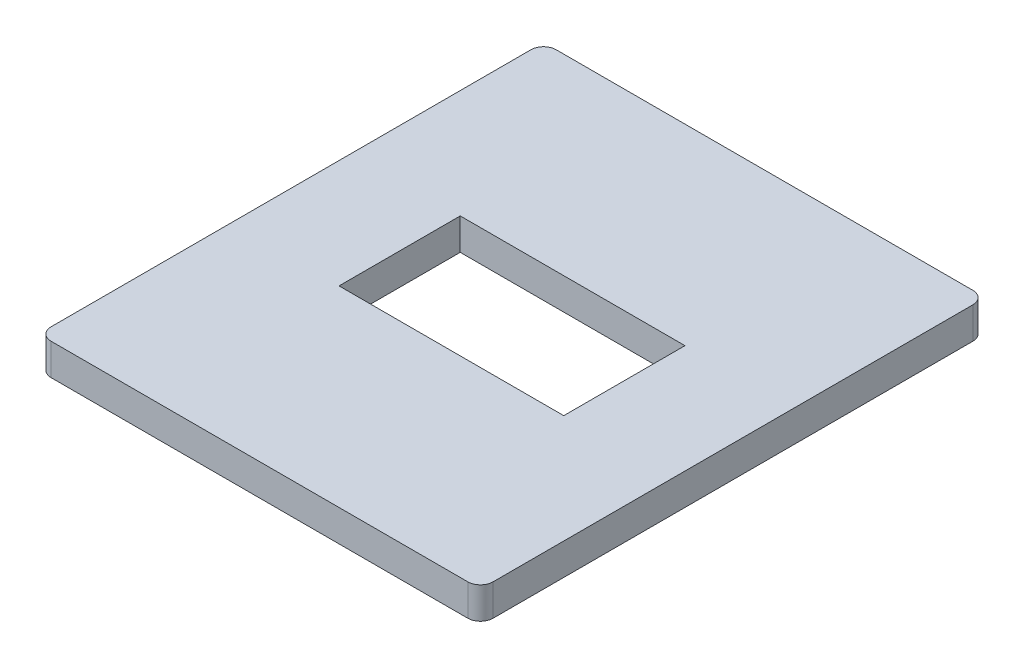
ISO-10303-21;
HEADER;
FILE_DESCRIPTION(('STEP AP214'),'2;1');
FILE_NAME('part.step','',(''),(''),'','','');
FILE_SCHEMA(('AUTOMOTIVE_DESIGN { 1 0 10303 214 1 1 1 1 }'));
ENDSEC;
DATA;
#1=APPLICATION_CONTEXT('core data for automotive mechanical design processes');
#2=APPLICATION_PROTOCOL_DEFINITION('international standard','automotive_design',2000,#1);
#3=PRODUCT_CONTEXT('',#1,'mechanical');
#4=PRODUCT('Part','Part','',(#3));
#5=PRODUCT_RELATED_PRODUCT_CATEGORY('part','',(#4));
#6=PRODUCT_DEFINITION_FORMATION('','',#4);
#7=PRODUCT_DEFINITION_CONTEXT('part definition',#1,'design');
#8=PRODUCT_DEFINITION('design','',#6,#7);
#9=PRODUCT_DEFINITION_SHAPE('','',#8);
#10=(LENGTH_UNIT() NAMED_UNIT(*) SI_UNIT(.MILLI.,.METRE.));
#11=(NAMED_UNIT(*) PLANE_ANGLE_UNIT() SI_UNIT($,.RADIAN.));
#12=(NAMED_UNIT(*) SI_UNIT($,.STERADIAN.) SOLID_ANGLE_UNIT());
#13=UNCERTAINTY_MEASURE_WITH_UNIT(LENGTH_MEASURE(1.E-05),#10,'distance_accuracy_value','');
#14=(GEOMETRIC_REPRESENTATION_CONTEXT(3) GLOBAL_UNCERTAINTY_ASSIGNED_CONTEXT((#13)) GLOBAL_UNIT_ASSIGNED_CONTEXT((#10,
#11,#12)) REPRESENTATION_CONTEXT('',''));
#15=CARTESIAN_POINT('',(0.,0.,0.));
#16=DIRECTION('',(0.,0.,1.));
#17=DIRECTION('',(1.,0.,0.));
#18=AXIS2_PLACEMENT_3D('',#15,#16,#17);
#19=CARTESIAN_POINT('',(0.,3.175,0.));
#20=DIRECTION('',(0.,1.,0.));
#21=DIRECTION('',(0.,0.,1.));
#22=AXIS2_PLACEMENT_3D('',#19,#20,#21);
#23=PLANE('',#22);
#24=DIRECTION('',(1.,0.,0.));
#25=VECTOR('',#24,1.);
#26=CARTESIAN_POINT('',(-22.554912538406,3.175,23.8437569767423));
#27=LINE('',#26,#25);
#28=CARTESIAN_POINT('',(-21.284912538406,3.175,23.8437569767423));
#29=VERTEX_POINT('',#28);
#30=CARTESIAN_POINT('',(20.625087461594,3.175,23.8437569767423));
#31=VERTEX_POINT('',#30);
#32=EDGE_CURVE('E163',#29,#31,#27,.T.);
#33=ORIENTED_EDGE('',*,*,#32,.T.);
#34=CARTESIAN_POINT('',(20.625087461594,3.175,22.5737569767423));
#35=DIRECTION('',(0.,1.,0.));
#36=DIRECTION('',(0.,0.,1.));
#37=AXIS2_PLACEMENT_3D('',#34,#35,#36);
#38=CIRCLE('',#37,1.27);
#39=CARTESIAN_POINT('',(21.895087461594,3.175,22.5737569767423));
#40=VERTEX_POINT('',#39);
#41=EDGE_CURVE('E206',#31,#40,#38,.T.);
#42=ORIENTED_EDGE('',*,*,#41,.T.);
#43=DIRECTION('',(0.,0.,-1.));
#44=VECTOR('',#43,1.);
#45=CARTESIAN_POINT('',(21.895087461594,3.175,23.8437569767423));
#46=LINE('',#45,#44);
#47=CARTESIAN_POINT('',(21.895087461594,3.175,-25.6862430232577));
#48=VERTEX_POINT('',#47);
#49=EDGE_CURVE('E166',#40,#48,#46,.T.);
#50=ORIENTED_EDGE('',*,*,#49,.T.);
#51=CARTESIAN_POINT('',(20.625087461594,3.175,-25.6862430232577));
#52=DIRECTION('',(0.,1.,0.));
#53=DIRECTION('',(0.,0.,1.));
#54=AXIS2_PLACEMENT_3D('',#51,#52,#53);
#55=CIRCLE('',#54,1.27);
#56=CARTESIAN_POINT('',(20.625087461594,3.175,-26.9562430232577));
#57=VERTEX_POINT('',#56);
#58=EDGE_CURVE('E204',#48,#57,#55,.T.);
#59=ORIENTED_EDGE('',*,*,#58,.T.);
#60=DIRECTION('',(-1.,0.,0.));
#61=VECTOR('',#60,1.);
#62=CARTESIAN_POINT('',(21.895087461594,3.175,-26.9562430232577));
#63=LINE('',#62,#61);
#64=CARTESIAN_POINT('',(-21.284912538406,3.175,-26.9562430232577));
#65=VERTEX_POINT('',#64);
#66=EDGE_CURVE('E170',#57,#65,#63,.T.);
#67=ORIENTED_EDGE('',*,*,#66,.T.);
#68=CARTESIAN_POINT('',(-21.284912538406,3.175,-25.6862430232577));
#69=DIRECTION('',(0.,1.,0.));
#70=DIRECTION('',(0.,0.,1.));
#71=AXIS2_PLACEMENT_3D('',#68,#69,#70);
#72=CIRCLE('',#71,1.27);
#73=CARTESIAN_POINT('',(-22.554912538406,3.175,-25.6862430232577));
#74=VERTEX_POINT('',#73);
#75=EDGE_CURVE('E52',#65,#74,#72,.T.);
#76=ORIENTED_EDGE('',*,*,#75,.T.);
#77=DIRECTION('',(0.,0.,1.));
#78=VECTOR('',#77,1.);
#79=CARTESIAN_POINT('',(-22.554912538406,3.175,-26.9562430232577));
#80=LINE('',#79,#78);
#81=CARTESIAN_POINT('',(-22.554912538406,3.175,22.5737569767423));
#82=VERTEX_POINT('',#81);
#83=EDGE_CURVE('E172',#74,#82,#80,.T.);
#84=ORIENTED_EDGE('',*,*,#83,.T.);
#85=CARTESIAN_POINT('',(-21.284912538406,3.175,22.5737569767423));
#86=DIRECTION('',(0.,1.,0.));
#87=DIRECTION('',(0.,0.,1.));
#88=AXIS2_PLACEMENT_3D('',#85,#86,#87);
#89=CIRCLE('',#88,1.27);
#90=EDGE_CURVE('E202',#82,#29,#89,.T.);
#91=ORIENTED_EDGE('',*,*,#90,.T.);
#92=EDGE_LOOP('',(#33,#42,#50,#59,#67,#76,#84,#91));
#93=FACE_BOUND('',#92,.T.);
#94=DIRECTION('',(-1.,0.,0.));
#95=VECTOR('',#94,1.);
#96=CARTESIAN_POINT('',(-11.632912538406,3.175,-7.65224302325765));
#97=LINE('',#96,#95);
#98=CARTESIAN_POINT('',(10.973087461594,3.175,-7.65224302325765));
#99=VERTEX_POINT('',#98);
#100=CARTESIAN_POINT('',(-11.632912538406,3.175,-7.65224302325765));
#101=VERTEX_POINT('',#100);
#102=EDGE_CURVE('E132',#99,#101,#97,.T.);
#103=ORIENTED_EDGE('',*,*,#102,.F.);
#104=DIRECTION('',(0.,0.,-1.));
#105=VECTOR('',#104,1.);
#106=CARTESIAN_POINT('',(10.973087461594,3.175,4.53975697674234));
#107=LINE('',#106,#105);
#108=CARTESIAN_POINT('',(10.973087461594,3.175,4.53975697674234));
#109=VERTEX_POINT('',#108);
#110=EDGE_CURVE('E122',#109,#99,#107,.T.);
#111=ORIENTED_EDGE('',*,*,#110,.F.);
#112=DIRECTION('',(1.,0.,0.));
#113=VECTOR('',#112,1.);
#114=CARTESIAN_POINT('',(-11.632912538406,3.175,4.53975697674234));
#115=LINE('',#114,#113);
#116=CARTESIAN_POINT('',(-11.632912538406,3.175,4.53975697674234));
#117=VERTEX_POINT('',#116);
#118=EDGE_CURVE('E147',#117,#109,#115,.T.);
#119=ORIENTED_EDGE('',*,*,#118,.F.);
#120=DIRECTION('',(0.,0.,1.));
#121=VECTOR('',#120,1.);
#122=CARTESIAN_POINT('',(-11.632912538406,3.175,4.53975697674234));
#123=LINE('',#122,#121);
#124=EDGE_CURVE('E145',#101,#117,#123,.T.);
#125=ORIENTED_EDGE('',*,*,#124,.F.);
#126=EDGE_LOOP('',(#103,#111,#119,#125));
#127=FACE_BOUND('',#126,.T.);
#128=ADVANCED_FACE('F32',(#93,#127),#23,.T.);
#129=CARTESIAN_POINT('',(0.,0.,0.));
#130=DIRECTION('',(0.,1.,0.));
#131=DIRECTION('',(0.,0.,1.));
#132=AXIS2_PLACEMENT_3D('',#129,#130,#131);
#133=PLANE('',#132);
#134=DIRECTION('',(0.,0.,-1.));
#135=VECTOR('',#134,1.);
#136=CARTESIAN_POINT('',(21.895087461594,0.,23.8437569767423));
#137=LINE('',#136,#135);
#138=CARTESIAN_POINT('',(21.895087461594,0.,22.5737569767423));
#139=VERTEX_POINT('',#138);
#140=CARTESIAN_POINT('',(21.895087461594,0.,-25.6862430232577));
#141=VERTEX_POINT('',#140);
#142=EDGE_CURVE('E177',#139,#141,#137,.T.);
#143=ORIENTED_EDGE('',*,*,#142,.F.);
#144=CARTESIAN_POINT('',(20.625087461594,0.,22.5737569767423));
#145=DIRECTION('',(0.,1.,0.));
#146=DIRECTION('',(0.,0.,1.));
#147=AXIS2_PLACEMENT_3D('',#144,#145,#146);
#148=CIRCLE('',#147,1.27);
#149=CARTESIAN_POINT('',(20.625087461594,0.,23.8437569767423));
#150=VERTEX_POINT('',#149);
#151=EDGE_CURVE('E194',#139,#150,#148,.F.);
#152=ORIENTED_EDGE('',*,*,#151,.T.);
#153=DIRECTION('',(1.,0.,0.));
#154=VECTOR('',#153,1.);
#155=CARTESIAN_POINT('',(-22.554912538406,0.,23.8437569767423));
#156=LINE('',#155,#154);
#157=CARTESIAN_POINT('',(-21.284912538406,0.,23.8437569767423));
#158=VERTEX_POINT('',#157);
#159=EDGE_CURVE('E140',#158,#150,#156,.T.);
#160=ORIENTED_EDGE('',*,*,#159,.F.);
#161=CARTESIAN_POINT('',(-21.284912538406,0.,22.5737569767423));
#162=DIRECTION('',(0.,1.,0.));
#163=DIRECTION('',(0.,0.,1.));
#164=AXIS2_PLACEMENT_3D('',#161,#162,#163);
#165=CIRCLE('',#164,1.27);
#166=CARTESIAN_POINT('',(-22.554912538406,0.,22.5737569767423));
#167=VERTEX_POINT('',#166);
#168=EDGE_CURVE('E190',#158,#167,#165,.F.);
#169=ORIENTED_EDGE('',*,*,#168,.T.);
#170=DIRECTION('',(0.,0.,1.));
#171=VECTOR('',#170,1.);
#172=CARTESIAN_POINT('',(-22.554912538406,0.,-26.9562430232577));
#173=LINE('',#172,#171);
#174=CARTESIAN_POINT('',(-22.554912538406,0.,-25.6862430232577));
#175=VERTEX_POINT('',#174);
#176=EDGE_CURVE('E167',#175,#167,#173,.T.);
#177=ORIENTED_EDGE('',*,*,#176,.F.);
#178=CARTESIAN_POINT('',(-21.284912538406,0.,-25.6862430232577));
#179=DIRECTION('',(0.,1.,0.));
#180=DIRECTION('',(0.,0.,1.));
#181=AXIS2_PLACEMENT_3D('',#178,#179,#180);
#182=CIRCLE('',#181,1.27);
#183=CARTESIAN_POINT('',(-21.284912538406,0.,-26.9562430232577));
#184=VERTEX_POINT('',#183);
#185=EDGE_CURVE('E188',#175,#184,#182,.F.);
#186=ORIENTED_EDGE('',*,*,#185,.T.);
#187=DIRECTION('',(-1.,0.,0.));
#188=VECTOR('',#187,1.);
#189=CARTESIAN_POINT('',(21.895087461594,0.,-26.9562430232577));
#190=LINE('',#189,#188);
#191=CARTESIAN_POINT('',(20.625087461594,0.,-26.9562430232577));
#192=VERTEX_POINT('',#191);
#193=EDGE_CURVE('E180',#192,#184,#190,.T.);
#194=ORIENTED_EDGE('',*,*,#193,.F.);
#195=CARTESIAN_POINT('',(20.625087461594,0.,-25.6862430232577));
#196=DIRECTION('',(0.,1.,0.));
#197=DIRECTION('',(0.,0.,1.));
#198=AXIS2_PLACEMENT_3D('',#195,#196,#197);
#199=CIRCLE('',#198,1.27);
#200=EDGE_CURVE('E192',#192,#141,#199,.F.);
#201=ORIENTED_EDGE('',*,*,#200,.T.);
#202=EDGE_LOOP('',(#143,#152,#160,#169,#177,#186,#194,#201));
#203=FACE_BOUND('',#202,.T.);
#204=DIRECTION('',(0.,0.,-1.));
#205=VECTOR('',#204,1.);
#206=CARTESIAN_POINT('',(10.973087461594,0.,4.53975697674234));
#207=LINE('',#206,#205);
#208=CARTESIAN_POINT('',(10.973087461594,0.,4.53975697674234));
#209=VERTEX_POINT('',#208);
#210=CARTESIAN_POINT('',(10.973087461594,0.,-7.65224302325765));
#211=VERTEX_POINT('',#210);
#212=EDGE_CURVE('E151',#209,#211,#207,.T.);
#213=ORIENTED_EDGE('',*,*,#212,.T.);
#214=DIRECTION('',(-1.,0.,0.));
#215=VECTOR('',#214,1.);
#216=CARTESIAN_POINT('',(-11.632912538406,0.,-7.65224302325765));
#217=LINE('',#216,#215);
#218=CARTESIAN_POINT('',(-11.632912538406,0.,-7.65224302325765));
#219=VERTEX_POINT('',#218);
#220=EDGE_CURVE('E139',#211,#219,#217,.T.);
#221=ORIENTED_EDGE('',*,*,#220,.T.);
#222=DIRECTION('',(0.,0.,1.));
#223=VECTOR('',#222,1.);
#224=CARTESIAN_POINT('',(-11.632912538406,0.,4.53975697674234));
#225=LINE('',#224,#223);
#226=CARTESIAN_POINT('',(-11.632912538406,0.,4.53975697674234));
#227=VERTEX_POINT('',#226);
#228=EDGE_CURVE('E154',#219,#227,#225,.T.);
#229=ORIENTED_EDGE('',*,*,#228,.T.);
#230=DIRECTION('',(1.,0.,0.));
#231=VECTOR('',#230,1.);
#232=CARTESIAN_POINT('',(-11.632912538406,0.,4.53975697674234));
#233=LINE('',#232,#231);
#234=EDGE_CURVE('E133',#227,#209,#233,.T.);
#235=ORIENTED_EDGE('',*,*,#234,.T.);
#236=EDGE_LOOP('',(#213,#221,#229,#235));
#237=FACE_BOUND('',#236,.T.);
#238=ADVANCED_FACE('F219',(#203,#237),#133,.F.);
#239=CARTESIAN_POINT('',(-22.554912538406,3.175,23.8437569767423));
#240=DIRECTION('',(0.,0.,-1.));
#241=DIRECTION('',(-1.,0.,0.));
#242=AXIS2_PLACEMENT_3D('',#239,#240,#241);
#243=PLANE('',#242);
#244=ORIENTED_EDGE('',*,*,#159,.T.);
#245=DIRECTION('',(0.,-1.,0.));
#246=VECTOR('',#245,1.);
#247=CARTESIAN_POINT('',(20.625087461594,3.175,23.8437569767423));
#248=LINE('',#247,#246);
#249=EDGE_CURVE('E199',#150,#31,#248,.F.);
#250=ORIENTED_EDGE('',*,*,#249,.T.);
#251=ORIENTED_EDGE('',*,*,#32,.F.);
#252=DIRECTION('',(0.,-1.,0.));
#253=VECTOR('',#252,1.);
#254=CARTESIAN_POINT('',(-21.284912538406,3.175,23.8437569767423));
#255=LINE('',#254,#253);
#256=EDGE_CURVE('E196',#29,#158,#255,.T.);
#257=ORIENTED_EDGE('',*,*,#256,.T.);
#258=EDGE_LOOP('',(#244,#250,#251,#257));
#259=FACE_BOUND('',#258,.T.);
#260=ADVANCED_FACE('F229',(#259),#243,.F.);
#261=CARTESIAN_POINT('',(21.895087461594,3.175,23.8437569767423));
#262=DIRECTION('',(-1.,0.,0.));
#263=DIRECTION('',(0.,0.,1.));
#264=AXIS2_PLACEMENT_3D('',#261,#262,#263);
#265=PLANE('',#264);
#266=ORIENTED_EDGE('',*,*,#49,.F.);
#267=DIRECTION('',(0.,-1.,0.));
#268=VECTOR('',#267,1.);
#269=CARTESIAN_POINT('',(21.895087461594,3.175,22.5737569767423));
#270=LINE('',#269,#268);
#271=EDGE_CURVE('E185',#40,#139,#270,.T.);
#272=ORIENTED_EDGE('',*,*,#271,.T.);
#273=ORIENTED_EDGE('',*,*,#142,.T.);
#274=DIRECTION('',(0.,-1.,0.));
#275=VECTOR('',#274,1.);
#276=CARTESIAN_POINT('',(21.895087461594,3.175,-25.6862430232577));
#277=LINE('',#276,#275);
#278=EDGE_CURVE('E174',#141,#48,#277,.F.);
#279=ORIENTED_EDGE('',*,*,#278,.T.);
#280=EDGE_LOOP('',(#266,#272,#273,#279));
#281=FACE_BOUND('',#280,.T.);
#282=ADVANCED_FACE('F237',(#281),#265,.F.);
#283=CARTESIAN_POINT('',(21.895087461594,3.175,-26.9562430232577));
#284=DIRECTION('',(0.,0.,1.));
#285=DIRECTION('',(1.,0.,0.));
#286=AXIS2_PLACEMENT_3D('',#283,#284,#285);
#287=PLANE('',#286);
#288=ORIENTED_EDGE('',*,*,#66,.F.);
#289=DIRECTION('',(0.,-1.,0.));
#290=VECTOR('',#289,1.);
#291=CARTESIAN_POINT('',(20.625087461594,3.175,-26.9562430232577));
#292=LINE('',#291,#290);
#293=EDGE_CURVE('E210',#57,#192,#292,.T.);
#294=ORIENTED_EDGE('',*,*,#293,.T.);
#295=ORIENTED_EDGE('',*,*,#193,.T.);
#296=DIRECTION('',(0.,-1.,0.));
#297=VECTOR('',#296,1.);
#298=CARTESIAN_POINT('',(-21.284912538406,3.175,-26.9562430232577));
#299=LINE('',#298,#297);
#300=EDGE_CURVE('E208',#184,#65,#299,.F.);
#301=ORIENTED_EDGE('',*,*,#300,.T.);
#302=EDGE_LOOP('',(#288,#294,#295,#301));
#303=FACE_BOUND('',#302,.T.);
#304=ADVANCED_FACE('F245',(#303),#287,.F.);
#305=CARTESIAN_POINT('',(-22.554912538406,3.175,-26.9562430232577));
#306=DIRECTION('',(1.,0.,0.));
#307=DIRECTION('',(0.,0.,-1.));
#308=AXIS2_PLACEMENT_3D('',#305,#306,#307);
#309=PLANE('',#308);
#310=ORIENTED_EDGE('',*,*,#176,.T.);
#311=DIRECTION('',(0.,-1.,0.));
#312=VECTOR('',#311,1.);
#313=CARTESIAN_POINT('',(-22.554912538406,3.175,22.5737569767423));
#314=LINE('',#313,#312);
#315=EDGE_CURVE('E11',#167,#82,#314,.F.);
#316=ORIENTED_EDGE('',*,*,#315,.T.);
#317=ORIENTED_EDGE('',*,*,#83,.F.);
#318=DIRECTION('',(0.,-1.,0.));
#319=VECTOR('',#318,1.);
#320=CARTESIAN_POINT('',(-22.554912538406,3.175,-25.6862430232577));
#321=LINE('',#320,#319);
#322=EDGE_CURVE('E40',#74,#175,#321,.T.);
#323=ORIENTED_EDGE('',*,*,#322,.T.);
#324=EDGE_LOOP('',(#310,#316,#317,#323));
#325=FACE_BOUND('',#324,.T.);
#326=ADVANCED_FACE('F215',(#325),#309,.F.);
#327=CARTESIAN_POINT('',(10.973087461594,3.175,4.53975697674234));
#328=DIRECTION('',(-1.,0.,0.));
#329=DIRECTION('',(0.,0.,1.));
#330=AXIS2_PLACEMENT_3D('',#327,#328,#329);
#331=PLANE('',#330);
#332=ORIENTED_EDGE('',*,*,#212,.F.);
#333=DIRECTION('',(0.,-1.,0.));
#334=VECTOR('',#333,1.);
#335=CARTESIAN_POINT('',(10.973087461594,3.175,4.53975697674234));
#336=LINE('',#335,#334);
#337=EDGE_CURVE('E128',#109,#209,#336,.T.);
#338=ORIENTED_EDGE('',*,*,#337,.F.);
#339=ORIENTED_EDGE('',*,*,#110,.T.);
#340=DIRECTION('',(0.,-1.,0.));
#341=VECTOR('',#340,1.);
#342=CARTESIAN_POINT('',(10.973087461594,3.175,-7.65224302325765));
#343=LINE('',#342,#341);
#344=EDGE_CURVE('E125',#99,#211,#343,.T.);
#345=ORIENTED_EDGE('',*,*,#344,.T.);
#346=EDGE_LOOP('',(#332,#338,#339,#345));
#347=FACE_BOUND('',#346,.T.);
#348=ADVANCED_FACE('F124',(#347),#331,.T.);
#349=CARTESIAN_POINT('',(-11.632912538406,3.175,-7.65224302325765));
#350=DIRECTION('',(0.,0.,1.));
#351=DIRECTION('',(1.,0.,0.));
#352=AXIS2_PLACEMENT_3D('',#349,#350,#351);
#353=PLANE('',#352);
#354=ORIENTED_EDGE('',*,*,#220,.F.);
#355=ORIENTED_EDGE('',*,*,#344,.F.);
#356=ORIENTED_EDGE('',*,*,#102,.T.);
#357=DIRECTION('',(0.,-1.,0.));
#358=VECTOR('',#357,1.);
#359=CARTESIAN_POINT('',(-11.632912538406,3.175,-7.65224302325765));
#360=LINE('',#359,#358);
#361=EDGE_CURVE('E141',#101,#219,#360,.T.);
#362=ORIENTED_EDGE('',*,*,#361,.T.);
#363=EDGE_LOOP('',(#354,#355,#356,#362));
#364=FACE_BOUND('',#363,.T.);
#365=ADVANCED_FACE('F136',(#364),#353,.T.);
#366=CARTESIAN_POINT('',(-11.632912538406,3.175,4.53975697674234));
#367=DIRECTION('',(1.,0.,0.));
#368=DIRECTION('',(0.,0.,-1.));
#369=AXIS2_PLACEMENT_3D('',#366,#367,#368);
#370=PLANE('',#369);
#371=ORIENTED_EDGE('',*,*,#228,.F.);
#372=ORIENTED_EDGE('',*,*,#361,.F.);
#373=ORIENTED_EDGE('',*,*,#124,.T.);
#374=DIRECTION('',(0.,-1.,0.));
#375=VECTOR('',#374,1.);
#376=CARTESIAN_POINT('',(-11.632912538406,3.175,4.53975697674234));
#377=LINE('',#376,#375);
#378=EDGE_CURVE('E160',#117,#227,#377,.T.);
#379=ORIENTED_EDGE('',*,*,#378,.T.);
#380=EDGE_LOOP('',(#371,#372,#373,#379));
#381=FACE_BOUND('',#380,.T.);
#382=ADVANCED_FACE('F301',(#381),#370,.T.);
#383=CARTESIAN_POINT('',(-11.632912538406,3.175,4.53975697674234));
#384=DIRECTION('',(0.,0.,-1.));
#385=DIRECTION('',(-1.,0.,0.));
#386=AXIS2_PLACEMENT_3D('',#383,#384,#385);
#387=PLANE('',#386);
#388=ORIENTED_EDGE('',*,*,#234,.F.);
#389=ORIENTED_EDGE('',*,*,#378,.F.);
#390=ORIENTED_EDGE('',*,*,#118,.T.);
#391=ORIENTED_EDGE('',*,*,#337,.T.);
#392=EDGE_LOOP('',(#388,#389,#390,#391));
#393=FACE_BOUND('',#392,.T.);
#394=ADVANCED_FACE('F270',(#393),#387,.T.);
#395=CARTESIAN_POINT('',(20.625087461594,3.175,22.5737569767423));
#396=DIRECTION('',(0.,-1.,0.));
#397=DIRECTION('',(0.,0.,-1.));
#398=AXIS2_PLACEMENT_3D('',#395,#396,#397);
#399=CYLINDRICAL_SURFACE('',#398,1.27);
#400=ORIENTED_EDGE('',*,*,#41,.F.);
#401=ORIENTED_EDGE('',*,*,#249,.F.);
#402=ORIENTED_EDGE('',*,*,#151,.F.);
#403=ORIENTED_EDGE('',*,*,#271,.F.);
#404=EDGE_LOOP('',(#400,#401,#402,#403));
#405=FACE_BOUND('',#404,.T.);
#406=ADVANCED_FACE('F235',(#405),#399,.T.);
#407=CARTESIAN_POINT('',(20.625087461594,3.175,-25.6862430232577));
#408=DIRECTION('',(0.,-1.,0.));
#409=DIRECTION('',(0.,0.,-1.));
#410=AXIS2_PLACEMENT_3D('',#407,#408,#409);
#411=CYLINDRICAL_SURFACE('',#410,1.27);
#412=ORIENTED_EDGE('',*,*,#58,.F.);
#413=ORIENTED_EDGE('',*,*,#278,.F.);
#414=ORIENTED_EDGE('',*,*,#200,.F.);
#415=ORIENTED_EDGE('',*,*,#293,.F.);
#416=EDGE_LOOP('',(#412,#413,#414,#415));
#417=FACE_BOUND('',#416,.T.);
#418=ADVANCED_FACE('F242',(#417),#411,.T.);
#419=CARTESIAN_POINT('',(-21.284912538406,3.175,22.5737569767423));
#420=DIRECTION('',(0.,-1.,0.));
#421=DIRECTION('',(0.,0.,-1.));
#422=AXIS2_PLACEMENT_3D('',#419,#420,#421);
#423=CYLINDRICAL_SURFACE('',#422,1.27);
#424=ORIENTED_EDGE('',*,*,#90,.F.);
#425=ORIENTED_EDGE('',*,*,#315,.F.);
#426=ORIENTED_EDGE('',*,*,#168,.F.);
#427=ORIENTED_EDGE('',*,*,#256,.F.);
#428=EDGE_LOOP('',(#424,#425,#426,#427));
#429=FACE_BOUND('',#428,.T.);
#430=ADVANCED_FACE('F226',(#429),#423,.T.);
#431=CARTESIAN_POINT('',(-21.284912538406,3.175,-25.6862430232577));
#432=DIRECTION('',(0.,-1.,0.));
#433=DIRECTION('',(0.,0.,-1.));
#434=AXIS2_PLACEMENT_3D('',#431,#432,#433);
#435=CYLINDRICAL_SURFACE('',#434,1.27);
#436=ORIENTED_EDGE('',*,*,#75,.F.);
#437=ORIENTED_EDGE('',*,*,#300,.F.);
#438=ORIENTED_EDGE('',*,*,#185,.F.);
#439=ORIENTED_EDGE('',*,*,#322,.F.);
#440=EDGE_LOOP('',(#436,#437,#438,#439));
#441=FACE_BOUND('',#440,.T.);
#442=ADVANCED_FACE('F34',(#441),#435,.T.);
#443=CLOSED_SHELL('',(#128,#238,#260,#282,#304,#326,#348,#365,#382,#394,#406,#418,#430,#442));
#444=MANIFOLD_SOLID_BREP('B2',#443);
#445=ADVANCED_BREP_SHAPE_REPRESENTATION('',(#18,#444),#14);
#446=SHAPE_DEFINITION_REPRESENTATION(#9,#445);
ENDSEC;
END-ISO-10303-21;
